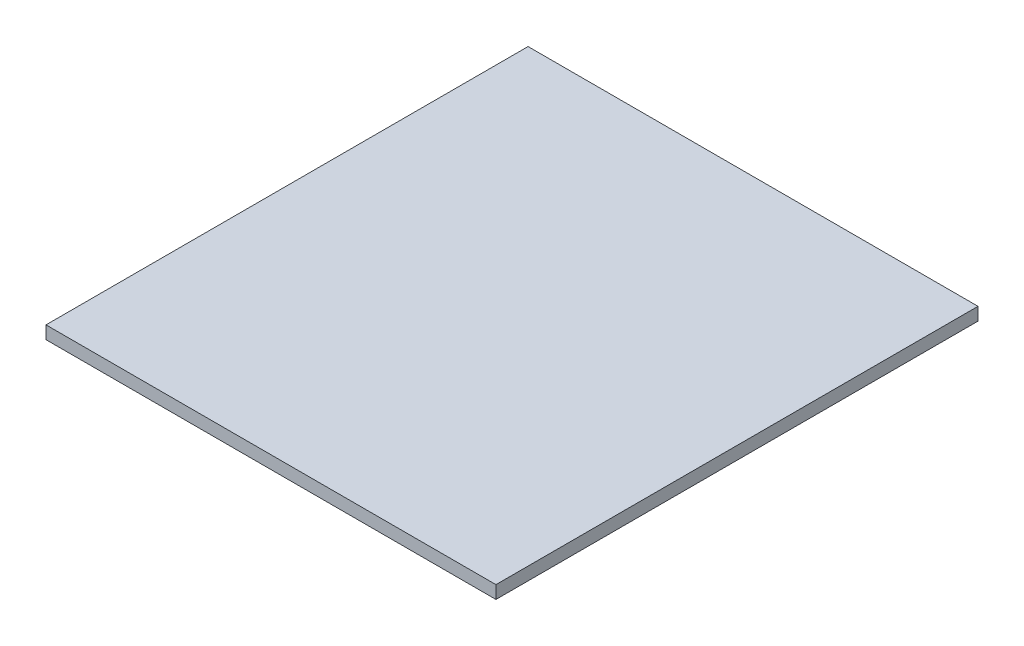
ISO-10303-21;
HEADER;
FILE_DESCRIPTION(('STEP AP214'),'2;1');
FILE_NAME('part.step','',(''),(''),'','','');
FILE_SCHEMA(('AUTOMOTIVE_DESIGN { 1 0 10303 214 1 1 1 1 }'));
ENDSEC;
DATA;
#1=APPLICATION_CONTEXT('core data for automotive mechanical design processes');
#2=APPLICATION_PROTOCOL_DEFINITION('international standard','automotive_design',2000,#1);
#3=PRODUCT_CONTEXT('',#1,'mechanical');
#4=PRODUCT('Part','Part','',(#3));
#5=PRODUCT_RELATED_PRODUCT_CATEGORY('part','',(#4));
#6=PRODUCT_DEFINITION_FORMATION('','',#4);
#7=PRODUCT_DEFINITION_CONTEXT('part definition',#1,'design');
#8=PRODUCT_DEFINITION('design','',#6,#7);
#9=PRODUCT_DEFINITION_SHAPE('','',#8);
#10=(LENGTH_UNIT() NAMED_UNIT(*) SI_UNIT(.MILLI.,.METRE.));
#11=(NAMED_UNIT(*) PLANE_ANGLE_UNIT() SI_UNIT($,.RADIAN.));
#12=(NAMED_UNIT(*) SI_UNIT($,.STERADIAN.) SOLID_ANGLE_UNIT());
#13=UNCERTAINTY_MEASURE_WITH_UNIT(LENGTH_MEASURE(1.E-05),#10,'distance_accuracy_value','');
#14=(GEOMETRIC_REPRESENTATION_CONTEXT(3) GLOBAL_UNCERTAINTY_ASSIGNED_CONTEXT((#13)) GLOBAL_UNIT_ASSIGNED_CONTEXT((#10,
#11,#12)) REPRESENTATION_CONTEXT('',''));
#15=CARTESIAN_POINT('',(0.,0.,0.));
#16=DIRECTION('',(0.,0.,1.));
#17=DIRECTION('',(1.,0.,0.));
#18=AXIS2_PLACEMENT_3D('',#15,#16,#17);
#19=CARTESIAN_POINT('',(70.,4.,75.));
#20=DIRECTION('',(-1.,0.,0.));
#21=DIRECTION('',(0.,0.,1.));
#22=AXIS2_PLACEMENT_3D('',#19,#20,#21);
#23=PLANE('',#22);
#24=DIRECTION('',(0.,0.,-1.));
#25=VECTOR('',#24,1.);
#26=CARTESIAN_POINT('',(70.,0.,75.));
#27=LINE('',#26,#25);
#28=CARTESIAN_POINT('',(70.,0.,75.));
#29=VERTEX_POINT('',#28);
#30=CARTESIAN_POINT('',(70.,0.,-75.));
#31=VERTEX_POINT('',#30);
#32=EDGE_CURVE('E113',#29,#31,#27,.T.);
#33=ORIENTED_EDGE('',*,*,#32,.T.);
#34=DIRECTION('',(0.,-1.,0.));
#35=VECTOR('',#34,1.);
#36=CARTESIAN_POINT('',(70.,4.,-75.));
#37=LINE('',#36,#35);
#38=CARTESIAN_POINT('',(70.,4.,-75.));
#39=VERTEX_POINT('',#38);
#40=EDGE_CURVE('E11',#39,#31,#37,.T.);
#41=ORIENTED_EDGE('',*,*,#40,.F.);
#42=DIRECTION('',(0.,0.,-1.));
#43=VECTOR('',#42,1.);
#44=CARTESIAN_POINT('',(70.,4.,75.));
#45=LINE('',#44,#43);
#46=CARTESIAN_POINT('',(70.,4.,75.));
#47=VERTEX_POINT('',#46);
#48=EDGE_CURVE('E97',#47,#39,#45,.T.);
#49=ORIENTED_EDGE('',*,*,#48,.F.);
#50=DIRECTION('',(0.,-1.,0.));
#51=VECTOR('',#50,1.);
#52=CARTESIAN_POINT('',(70.,4.,75.));
#53=LINE('',#52,#51);
#54=EDGE_CURVE('E109',#47,#29,#53,.T.);
#55=ORIENTED_EDGE('',*,*,#54,.T.);
#56=EDGE_LOOP('',(#33,#41,#49,#55));
#57=FACE_BOUND('',#56,.T.);
#58=ADVANCED_FACE('F45',(#57),#23,.F.);
#59=CARTESIAN_POINT('',(-70.,4.,-75.));
#60=DIRECTION('',(0.,0.,1.));
#61=DIRECTION('',(1.,0.,0.));
#62=AXIS2_PLACEMENT_3D('',#59,#60,#61);
#63=PLANE('',#62);
#64=DIRECTION('',(-1.,0.,0.));
#65=VECTOR('',#64,1.);
#66=CARTESIAN_POINT('',(-70.,0.,-75.));
#67=LINE('',#66,#65);
#68=CARTESIAN_POINT('',(-70.,0.,-75.));
#69=VERTEX_POINT('',#68);
#70=EDGE_CURVE('E102',#31,#69,#67,.T.);
#71=ORIENTED_EDGE('',*,*,#70,.T.);
#72=DIRECTION('',(0.,-1.,0.));
#73=VECTOR('',#72,1.);
#74=CARTESIAN_POINT('',(-70.,4.,-75.));
#75=LINE('',#74,#73);
#76=CARTESIAN_POINT('',(-70.,4.,-75.));
#77=VERTEX_POINT('',#76);
#78=EDGE_CURVE('E54',#77,#69,#75,.T.);
#79=ORIENTED_EDGE('',*,*,#78,.F.);
#80=DIRECTION('',(-1.,0.,0.));
#81=VECTOR('',#80,1.);
#82=CARTESIAN_POINT('',(-70.,4.,-75.));
#83=LINE('',#82,#81);
#84=EDGE_CURVE('E92',#39,#77,#83,.T.);
#85=ORIENTED_EDGE('',*,*,#84,.F.);
#86=ORIENTED_EDGE('',*,*,#40,.T.);
#87=EDGE_LOOP('',(#71,#79,#85,#86));
#88=FACE_BOUND('',#87,.T.);
#89=ADVANCED_FACE('F101',(#88),#63,.F.);
#90=CARTESIAN_POINT('',(-70.,4.,75.));
#91=DIRECTION('',(1.,0.,0.));
#92=DIRECTION('',(0.,0.,-1.));
#93=AXIS2_PLACEMENT_3D('',#90,#91,#92);
#94=PLANE('',#93);
#95=DIRECTION('',(0.,0.,1.));
#96=VECTOR('',#95,1.);
#97=CARTESIAN_POINT('',(-70.,0.,75.));
#98=LINE('',#97,#96);
#99=CARTESIAN_POINT('',(-70.,0.,75.));
#100=VERTEX_POINT('',#99);
#101=EDGE_CURVE('E79',#69,#100,#98,.T.);
#102=ORIENTED_EDGE('',*,*,#101,.T.);
#103=DIRECTION('',(0.,-1.,0.));
#104=VECTOR('',#103,1.);
#105=CARTESIAN_POINT('',(-70.,4.,75.));
#106=LINE('',#105,#104);
#107=CARTESIAN_POINT('',(-70.,4.,75.));
#108=VERTEX_POINT('',#107);
#109=EDGE_CURVE('E104',#108,#100,#106,.T.);
#110=ORIENTED_EDGE('',*,*,#109,.F.);
#111=DIRECTION('',(0.,0.,1.));
#112=VECTOR('',#111,1.);
#113=CARTESIAN_POINT('',(-70.,4.,75.));
#114=LINE('',#113,#112);
#115=EDGE_CURVE('E95',#77,#108,#114,.T.);
#116=ORIENTED_EDGE('',*,*,#115,.F.);
#117=ORIENTED_EDGE('',*,*,#78,.T.);
#118=EDGE_LOOP('',(#102,#110,#116,#117));
#119=FACE_BOUND('',#118,.T.);
#120=ADVANCED_FACE('F105',(#119),#94,.F.);
#121=CARTESIAN_POINT('',(-70.,4.,75.));
#122=DIRECTION('',(0.,0.,-1.));
#123=DIRECTION('',(-1.,0.,0.));
#124=AXIS2_PLACEMENT_3D('',#121,#122,#123);
#125=PLANE('',#124);
#126=DIRECTION('',(1.,0.,0.));
#127=VECTOR('',#126,1.);
#128=CARTESIAN_POINT('',(-70.,0.,75.));
#129=LINE('',#128,#127);
#130=EDGE_CURVE('E85',#100,#29,#129,.T.);
#131=ORIENTED_EDGE('',*,*,#130,.T.);
#132=ORIENTED_EDGE('',*,*,#54,.F.);
#133=DIRECTION('',(1.,0.,0.));
#134=VECTOR('',#133,1.);
#135=CARTESIAN_POINT('',(-70.,4.,75.));
#136=LINE('',#135,#134);
#137=EDGE_CURVE('E62',#108,#47,#136,.T.);
#138=ORIENTED_EDGE('',*,*,#137,.F.);
#139=ORIENTED_EDGE('',*,*,#109,.T.);
#140=EDGE_LOOP('',(#131,#132,#138,#139));
#141=FACE_BOUND('',#140,.T.);
#142=ADVANCED_FACE('F126',(#141),#125,.F.);
#143=CARTESIAN_POINT('',(0.,4.,0.));
#144=DIRECTION('',(0.,-1.,0.));
#145=DIRECTION('',(0.,0.,-1.));
#146=AXIS2_PLACEMENT_3D('',#143,#144,#145);
#147=PLANE('',#146);
#148=ORIENTED_EDGE('',*,*,#48,.T.);
#149=ORIENTED_EDGE('',*,*,#84,.T.);
#150=ORIENTED_EDGE('',*,*,#115,.T.);
#151=ORIENTED_EDGE('',*,*,#137,.T.);
#152=EDGE_LOOP('',(#148,#149,#150,#151));
#153=FACE_BOUND('',#152,.T.);
#154=ADVANCED_FACE('F93',(#153),#147,.F.);
#155=CARTESIAN_POINT('',(0.,0.,0.));
#156=DIRECTION('',(0.,-1.,0.));
#157=DIRECTION('',(0.,0.,-1.));
#158=AXIS2_PLACEMENT_3D('',#155,#156,#157);
#159=PLANE('',#158);
#160=ORIENTED_EDGE('',*,*,#32,.F.);
#161=ORIENTED_EDGE('',*,*,#130,.F.);
#162=ORIENTED_EDGE('',*,*,#101,.F.);
#163=ORIENTED_EDGE('',*,*,#70,.F.);
#164=EDGE_LOOP('',(#160,#161,#162,#163));
#165=FACE_BOUND('',#164,.T.);
#166=ADVANCED_FACE('F129',(#165),#159,.T.);
#167=CLOSED_SHELL('',(#58,#89,#120,#142,#154,#166));
#168=MANIFOLD_SOLID_BREP('B2',#167);
#169=ADVANCED_BREP_SHAPE_REPRESENTATION('',(#18,#168),#14);
#170=SHAPE_DEFINITION_REPRESENTATION(#9,#169);
ENDSEC;
END-ISO-10303-21;
